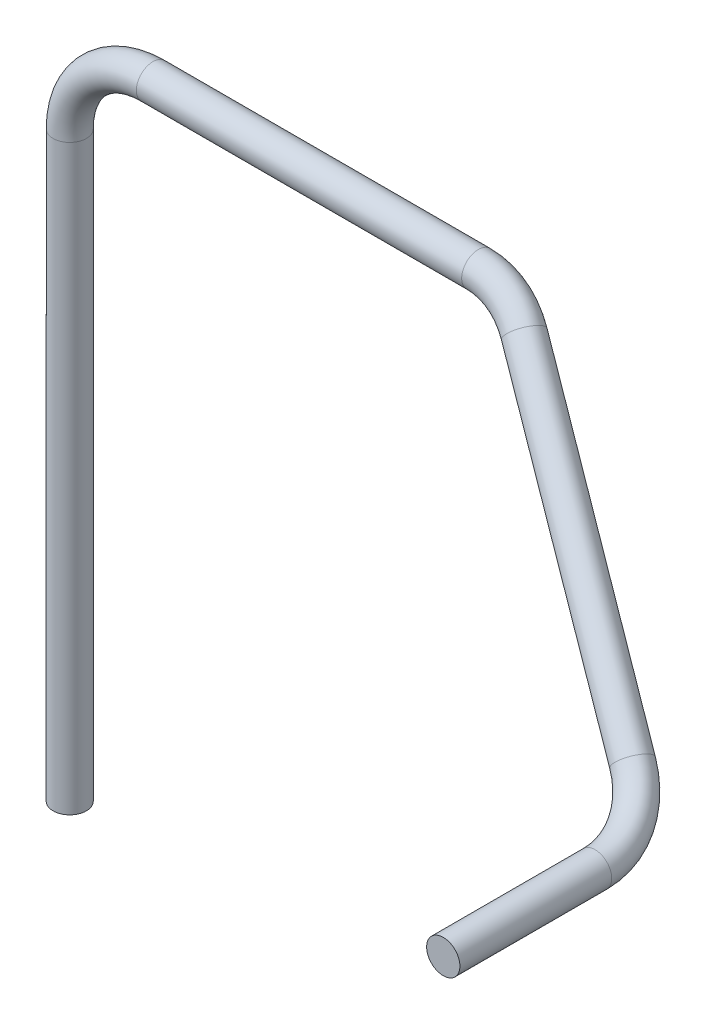
ISO-10303-21;
HEADER;
FILE_DESCRIPTION(('STEP AP214'),'2;1');
FILE_NAME('part.step','',(''),(''),'','','');
FILE_SCHEMA(('AUTOMOTIVE_DESIGN { 1 0 10303 214 1 1 1 1 }'));
ENDSEC;
DATA;
#1=APPLICATION_CONTEXT('core data for automotive mechanical design processes');
#2=APPLICATION_PROTOCOL_DEFINITION('international standard','automotive_design',2000,#1);
#3=PRODUCT_CONTEXT('',#1,'mechanical');
#4=PRODUCT('Part','Part','',(#3));
#5=PRODUCT_RELATED_PRODUCT_CATEGORY('part','',(#4));
#6=PRODUCT_DEFINITION_FORMATION('','',#4);
#7=PRODUCT_DEFINITION_CONTEXT('part definition',#1,'design');
#8=PRODUCT_DEFINITION('design','',#6,#7);
#9=PRODUCT_DEFINITION_SHAPE('','',#8);
#10=(LENGTH_UNIT() NAMED_UNIT(*) SI_UNIT(.MILLI.,.METRE.));
#11=(NAMED_UNIT(*) PLANE_ANGLE_UNIT() SI_UNIT($,.RADIAN.));
#12=(NAMED_UNIT(*) SI_UNIT($,.STERADIAN.) SOLID_ANGLE_UNIT());
#13=UNCERTAINTY_MEASURE_WITH_UNIT(LENGTH_MEASURE(1.E-05),#10,'distance_accuracy_value','');
#14=(GEOMETRIC_REPRESENTATION_CONTEXT(3) GLOBAL_UNCERTAINTY_ASSIGNED_CONTEXT((#13)) GLOBAL_UNIT_ASSIGNED_CONTEXT((#10,
#11,#12)) REPRESENTATION_CONTEXT('',''));
#15=CARTESIAN_POINT('',(0.,0.,0.));
#16=DIRECTION('',(0.,0.,1.));
#17=DIRECTION('',(1.,0.,0.));
#18=AXIS2_PLACEMENT_3D('',#15,#16,#17);
#19=CARTESIAN_POINT('',(0.,0.,0.));
#20=DIRECTION('',(0.,1.,0.));
#21=DIRECTION('',(0.,0.,1.));
#22=AXIS2_PLACEMENT_3D('',#19,#20,#21);
#23=PLANE('',#22);
#24=CARTESIAN_POINT('',(0.,0.,0.));
#25=DIRECTION('',(0.,1.,0.));
#26=DIRECTION('',(0.,0.,1.));
#27=AXIS2_PLACEMENT_3D('',#24,#25,#26);
#28=CIRCLE('',#27,2.);
#29=CARTESIAN_POINT('',(0.,0.,2.));
#30=VERTEX_POINT('',#29);
#31=EDGE_CURVE('E65',#30,#30,#28,.T.);
#32=ORIENTED_EDGE('',*,*,#31,.F.);
#33=EDGE_LOOP('',(#32));
#34=FACE_BOUND('',#33,.T.);
#35=ADVANCED_FACE('F37',(#34),#23,.F.);
#36=CARTESIAN_POINT('',(88.6067946629131,50.,43.7082869338698));
#37=DIRECTION('',(0.,0.,1.));
#38=DIRECTION('',(-0.846537348727195,0.532329331532587,0.));
#39=AXIS2_PLACEMENT_3D('',#36,#37,#38);
#40=PLANE('',#39);
#41=CARTESIAN_POINT('',(88.6067946629131,50.,43.7082869338698));
#42=DIRECTION('',(0.,0.,1.));
#43=DIRECTION('',(-0.846537348727195,0.532329331532587,0.));
#44=AXIS2_PLACEMENT_3D('',#41,#42,#43);
#45=CIRCLE('',#44,2.);
#46=CARTESIAN_POINT('',(86.9137199654587,51.0646586630652,43.7082869338698));
#47=VERTEX_POINT('',#46);
#48=EDGE_CURVE('E10',#47,#47,#45,.T.);
#49=ORIENTED_EDGE('',*,*,#48,.T.);
#50=EDGE_LOOP('',(#49));
#51=FACE_BOUND('',#50,.T.);
#52=ADVANCED_FACE('F72',(#51),#40,.T.);
#53=CARTESIAN_POINT('',(0.,0.,0.));
#54=DIRECTION('',(0.,1.,0.));
#55=DIRECTION('',(0.,0.,1.));
#56=AXIS2_PLACEMENT_3D('',#53,#54,#55);
#57=CYLINDRICAL_SURFACE('',#56,2.);
#58=CARTESIAN_POINT('',(0.,70.,0.));
#59=DIRECTION('',(0.,1.,0.));
#60=DIRECTION('',(0.,0.,1.));
#61=AXIS2_PLACEMENT_3D('',#58,#59,#60);
#62=CIRCLE('',#61,2.);
#63=CARTESIAN_POINT('',(-2.,70.,0.));
#64=VERTEX_POINT('',#63);
#65=EDGE_CURVE('E62',#64,#64,#62,.T.);
#66=ORIENTED_EDGE('',*,*,#65,.F.);
#67=EDGE_LOOP('',(#66));
#68=FACE_BOUND('',#67,.T.);
#69=ORIENTED_EDGE('',*,*,#31,.T.);
#70=EDGE_LOOP('',(#69));
#71=FACE_BOUND('',#70,.T.);
#72=ADVANCED_FACE('F69',(#68,#71),#57,.T.);
#73=CARTESIAN_POINT('',(10.,70.,0.));
#74=DIRECTION('',(0.,0.,-1.));
#75=DIRECTION('',(-1.,0.,0.));
#76=AXIS2_PLACEMENT_3D('',#73,#74,#75);
#77=TOROIDAL_SURFACE('',#76,10.,2.);
#78=CARTESIAN_POINT('',(10.,80.,0.));
#79=DIRECTION('',(1.,0.,0.));
#80=DIRECTION('',(0.,0.,1.));
#81=AXIS2_PLACEMENT_3D('',#78,#79,#80);
#82=CIRCLE('',#81,2.);
#83=CARTESIAN_POINT('',(10.,82.,0.));
#84=VERTEX_POINT('',#83);
#85=EDGE_CURVE('E59',#84,#84,#82,.T.);
#86=CARTESIAN_POINT('',(10.,70.,0.));
#87=DIRECTION('',(0.,0.,-1.));
#88=DIRECTION('',(-1.,0.,0.));
#89=AXIS2_PLACEMENT_3D('',#86,#87,#88);
#90=CIRCLE('',#89,12.);
#91=EDGE_CURVE('',#64,#84,#90,.T.);
#92=ORIENTED_EDGE('',*,*,#65,.T.);
#93=ORIENTED_EDGE('',*,*,#85,.F.);
#94=ORIENTED_EDGE('',*,*,#91,.T.);
#95=ORIENTED_EDGE('',*,*,#91,.F.);
#96=EDGE_LOOP('',(#92,#94,#93,#95));
#97=FACE_BOUND('',#96,.T.);
#98=ADVANCED_FACE('F98',(#97),#77,.T.);
#99=CARTESIAN_POINT('',(10.,80.,0.));
#100=DIRECTION('',(1.,0.,0.));
#101=DIRECTION('',(0.,0.,-1.));
#102=AXIS2_PLACEMENT_3D('',#99,#100,#101);
#103=CYLINDRICAL_SURFACE('',#102,2.);
#104=CARTESIAN_POINT('',(49.1093199798548,80.,0.));
#105=DIRECTION('',(1.,0.,0.));
#106=DIRECTION('',(0.,0.,1.));
#107=AXIS2_PLACEMENT_3D('',#104,#105,#106);
#108=CIRCLE('',#107,2.);
#109=CARTESIAN_POINT('',(49.1093199798548,81.6970562748477,-1.05830052442586));
#110=VERTEX_POINT('',#109);
#111=EDGE_CURVE('E56',#110,#110,#108,.T.);
#112=ORIENTED_EDGE('',*,*,#111,.F.);
#113=EDGE_LOOP('',(#112));
#114=FACE_BOUND('',#113,.T.);
#115=ORIENTED_EDGE('',*,*,#85,.T.);
#116=EDGE_LOOP('',(#115));
#117=FACE_BOUND('',#116,.T.);
#118=ADVANCED_FACE('F94',(#114,#117),#103,.T.);
#119=CARTESIAN_POINT('',(49.1093199798548,71.5147186257615,5.29150262212927));
#120=DIRECTION('',(0.,-0.52915026221292,-0.848528137423856));
#121=DIRECTION('',(0.,0.848528137423856,-0.52915026221292));
#122=AXIS2_PLACEMENT_3D('',#119,#120,#121);
#123=TOROIDAL_SURFACE('',#122,10.,2.);
#124=CARTESIAN_POINT('',(56.1803877917203,77.5147186257615,1.54984523535533));
#125=DIRECTION('',(0.707106781186547,-0.599999999999999,0.374165738677397));
#126=DIRECTION('',(-0.374165738677398,0.131508729085123,0.917989898732232));
#127=AXIS2_PLACEMENT_3D('',#124,#125,#126);
#128=CIRCLE('',#127,2.);
#129=CARTESIAN_POINT('',(57.5946013540934,78.7147186257615,0.801513758000544));
#130=VERTEX_POINT('',#129);
#131=EDGE_CURVE('E51',#130,#130,#128,.T.);
#132=CARTESIAN_POINT('',(49.1093199798548,71.5147186257615,5.29150262212927));
#133=DIRECTION('',(0.,-0.52915026221292,-0.848528137423856));
#134=DIRECTION('',(0.,0.848528137423856,-0.52915026221292));
#135=AXIS2_PLACEMENT_3D('',#132,#133,#134);
#136=CIRCLE('',#135,12.);
#137=EDGE_CURVE('',#110,#130,#136,.T.);
#138=ORIENTED_EDGE('',*,*,#111,.T.);
#139=ORIENTED_EDGE('',*,*,#131,.F.);
#140=ORIENTED_EDGE('',*,*,#137,.T.);
#141=ORIENTED_EDGE('',*,*,#137,.F.);
#142=EDGE_LOOP('',(#138,#140,#139,#141));
#143=FACE_BOUND('',#142,.T.);
#144=ADVANCED_FACE('F90',(#143),#123,.T.);
#145=CARTESIAN_POINT('',(56.1803877917203,77.5147186257614,1.54984523535525));
#146=DIRECTION('',(0.707106781186546,-0.6,0.374165738677396));
#147=DIRECTION('',(0.646996639220631,0.762492851663023,0.));
#148=AXIS2_PLACEMENT_3D('',#145,#146,#147);
#149=CYLINDRICAL_SURFACE('',#148,2.);
#150=CARTESIAN_POINT('',(83.8348531570702,54.0491266378485,16.1832128347883));
#151=DIRECTION('',(0.707106781186546,-0.6,0.374165738677396));
#152=DIRECTION('',(-0.374165738677397,0.131508729085122,0.917989898732232));
#153=AXIS2_PLACEMENT_3D('',#150,#151,#152);
#154=CIRCLE('',#153,2.);
#155=CARTESIAN_POINT('',(84.4054505592276,53.564958686977,14.3284891356891));
#156=VERTEX_POINT('',#155);
#157=EDGE_CURVE('E47',#156,#156,#154,.T.);
#158=ORIENTED_EDGE('',*,*,#157,.F.);
#159=EDGE_LOOP('',(#158));
#160=FACE_BOUND('',#159,.T.);
#161=ORIENTED_EDGE('',*,*,#131,.T.);
#162=EDGE_LOOP('',(#161));
#163=FACE_BOUND('',#162,.T.);
#164=ADVANCED_FACE('F84',(#160,#163),#149,.T.);
#165=CARTESIAN_POINT('',(80.9818661462829,56.4699663922063,25.456831330284));
#166=DIRECTION('',(-0.646996639220631,-0.762492851663023,0.));
#167=DIRECTION('',(0.762492851663023,-0.646996639220631,0.));
#168=AXIS2_PLACEMENT_3D('',#165,#166,#167);
#169=TOROIDAL_SURFACE('',#168,10.,2.);
#170=CARTESIAN_POINT('',(88.6067946629131,50.,25.456831330284));
#171=DIRECTION('',(0.,0.,1.));
#172=DIRECTION('',(-0.846537348727195,0.532329331532587,0.));
#173=AXIS2_PLACEMENT_3D('',#170,#171,#172);
#174=CIRCLE('',#173,2.);
#175=CARTESIAN_POINT('',(90.1317803662392,48.7060067215587,25.456831330284));
#176=VERTEX_POINT('',#175);
#177=EDGE_CURVE('E43',#176,#176,#174,.T.);
#178=CARTESIAN_POINT('',(80.9818661462829,56.4699663922063,25.456831330284));
#179=DIRECTION('',(-0.646996639220631,-0.762492851663023,0.));
#180=DIRECTION('',(0.762492851663023,-0.646996639220631,0.));
#181=AXIS2_PLACEMENT_3D('',#178,#179,#180);
#182=CIRCLE('',#181,12.);
#183=EDGE_CURVE('',#156,#176,#182,.T.);
#184=ORIENTED_EDGE('',*,*,#157,.T.);
#185=ORIENTED_EDGE('',*,*,#177,.F.);
#186=ORIENTED_EDGE('',*,*,#183,.T.);
#187=ORIENTED_EDGE('',*,*,#183,.F.);
#188=EDGE_LOOP('',(#184,#186,#185,#187));
#189=FACE_BOUND('',#188,.T.);
#190=ADVANCED_FACE('F78',(#189),#169,.T.);
#191=CARTESIAN_POINT('',(88.6067946629131,50.,25.456831330284));
#192=DIRECTION('',(0.,0.,1.));
#193=DIRECTION('',(0.,-1.,0.));
#194=AXIS2_PLACEMENT_3D('',#191,#192,#193);
#195=CYLINDRICAL_SURFACE('',#194,2.);
#196=ORIENTED_EDGE('',*,*,#48,.F.);
#197=EDGE_LOOP('',(#196));
#198=FACE_BOUND('',#197,.T.);
#199=ORIENTED_EDGE('',*,*,#177,.T.);
#200=EDGE_LOOP('',(#199));
#201=FACE_BOUND('',#200,.T.);
#202=ADVANCED_FACE('F76',(#198,#201),#195,.T.);
#203=CLOSED_SHELL('',(#35,#52,#72,#98,#118,#144,#164,#190,#202));
#204=MANIFOLD_SOLID_BREP('B2',#203);
#205=ADVANCED_BREP_SHAPE_REPRESENTATION('',(#18,#204),#14);
#206=SHAPE_DEFINITION_REPRESENTATION(#9,#205);
ENDSEC;
END-ISO-10303-21;
